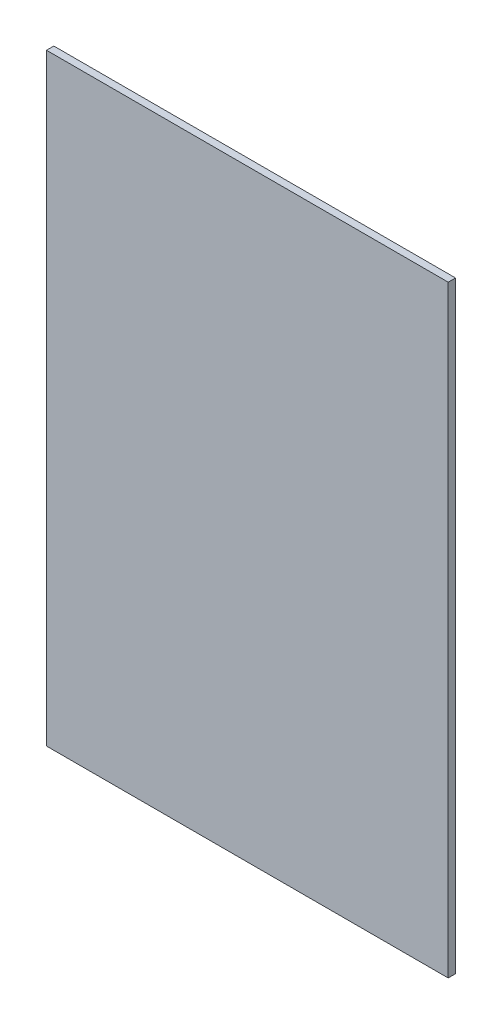
ISO-10303-21;
HEADER;
FILE_DESCRIPTION(('STEP AP214'),'2;1');
FILE_NAME('part.step','',(''),(''),'','','');
FILE_SCHEMA(('AUTOMOTIVE_DESIGN { 1 0 10303 214 1 1 1 1 }'));
ENDSEC;
DATA;
#1=APPLICATION_CONTEXT('core data for automotive mechanical design processes');
#2=APPLICATION_PROTOCOL_DEFINITION('international standard','automotive_design',2000,#1);
#3=PRODUCT_CONTEXT('',#1,'mechanical');
#4=PRODUCT('Part','Part','',(#3));
#5=PRODUCT_RELATED_PRODUCT_CATEGORY('part','',(#4));
#6=PRODUCT_DEFINITION_FORMATION('','',#4);
#7=PRODUCT_DEFINITION_CONTEXT('part definition',#1,'design');
#8=PRODUCT_DEFINITION('design','',#6,#7);
#9=PRODUCT_DEFINITION_SHAPE('','',#8);
#10=(LENGTH_UNIT() NAMED_UNIT(*) SI_UNIT(.MILLI.,.METRE.));
#11=(NAMED_UNIT(*) PLANE_ANGLE_UNIT() SI_UNIT($,.RADIAN.));
#12=(NAMED_UNIT(*) SI_UNIT($,.STERADIAN.) SOLID_ANGLE_UNIT());
#13=UNCERTAINTY_MEASURE_WITH_UNIT(LENGTH_MEASURE(1.E-05),#10,'distance_accuracy_value','');
#14=(GEOMETRIC_REPRESENTATION_CONTEXT(3) GLOBAL_UNCERTAINTY_ASSIGNED_CONTEXT((#13)) GLOBAL_UNIT_ASSIGNED_CONTEXT((#10,
#11,#12)) REPRESENTATION_CONTEXT('',''));
#15=CARTESIAN_POINT('',(0.,0.,0.));
#16=DIRECTION('',(0.,0.,1.));
#17=DIRECTION('',(1.,0.,0.));
#18=AXIS2_PLACEMENT_3D('',#15,#16,#17);
#19=CARTESIAN_POINT('',(0.,0.,11.1125));
#20=DIRECTION('',(1.,0.,0.));
#21=DIRECTION('',(0.,0.,-1.));
#22=AXIS2_PLACEMENT_3D('',#19,#20,#21);
#23=PLANE('',#22);
#24=DIRECTION('',(0.,-1.,0.));
#25=VECTOR('',#24,1.);
#26=CARTESIAN_POINT('',(0.,0.,0.));
#27=LINE('',#26,#25);
#28=CARTESIAN_POINT('',(0.,914.4,0.));
#29=VERTEX_POINT('',#28);
#30=CARTESIAN_POINT('',(0.,0.,0.));
#31=VERTEX_POINT('',#30);
#32=EDGE_CURVE('E95',#29,#31,#27,.T.);
#33=ORIENTED_EDGE('',*,*,#32,.T.);
#34=DIRECTION('',(0.,0.,-1.));
#35=VECTOR('',#34,1.);
#36=CARTESIAN_POINT('',(0.,0.,11.1125));
#37=LINE('',#36,#35);
#38=CARTESIAN_POINT('',(0.,0.,11.1125));
#39=VERTEX_POINT('',#38);
#40=EDGE_CURVE('E11',#39,#31,#37,.T.);
#41=ORIENTED_EDGE('',*,*,#40,.F.);
#42=DIRECTION('',(0.,-1.,0.));
#43=VECTOR('',#42,1.);
#44=CARTESIAN_POINT('',(0.,0.,11.1125));
#45=LINE('',#44,#43);
#46=CARTESIAN_POINT('',(0.,914.4,11.1125));
#47=VERTEX_POINT('',#46);
#48=EDGE_CURVE('E83',#47,#39,#45,.T.);
#49=ORIENTED_EDGE('',*,*,#48,.F.);
#50=DIRECTION('',(0.,0.,-1.));
#51=VECTOR('',#50,1.);
#52=CARTESIAN_POINT('',(0.,914.4,11.1125));
#53=LINE('',#52,#51);
#54=EDGE_CURVE('E91',#47,#29,#53,.T.);
#55=ORIENTED_EDGE('',*,*,#54,.T.);
#56=EDGE_LOOP('',(#33,#41,#49,#55));
#57=FACE_BOUND('',#56,.T.);
#58=ADVANCED_FACE('F32',(#57),#23,.F.);
#59=CARTESIAN_POINT('',(0.,0.,11.1125));
#60=DIRECTION('',(0.,1.,0.));
#61=DIRECTION('',(0.,0.,1.));
#62=AXIS2_PLACEMENT_3D('',#59,#60,#61);
#63=PLANE('',#62);
#64=DIRECTION('',(1.,0.,0.));
#65=VECTOR('',#64,1.);
#66=CARTESIAN_POINT('',(0.,0.,0.));
#67=LINE('',#66,#65);
#68=CARTESIAN_POINT('',(609.6,0.,0.));
#69=VERTEX_POINT('',#68);
#70=EDGE_CURVE('E87',#31,#69,#67,.T.);
#71=ORIENTED_EDGE('',*,*,#70,.T.);
#72=DIRECTION('',(0.,0.,-1.));
#73=VECTOR('',#72,1.);
#74=CARTESIAN_POINT('',(609.6,0.,11.1125));
#75=LINE('',#74,#73);
#76=CARTESIAN_POINT('',(609.6,0.,11.1125));
#77=VERTEX_POINT('',#76);
#78=EDGE_CURVE('E40',#77,#69,#75,.T.);
#79=ORIENTED_EDGE('',*,*,#78,.F.);
#80=DIRECTION('',(1.,0.,0.));
#81=VECTOR('',#80,1.);
#82=CARTESIAN_POINT('',(0.,0.,11.1125));
#83=LINE('',#82,#81);
#84=EDGE_CURVE('E78',#39,#77,#83,.T.);
#85=ORIENTED_EDGE('',*,*,#84,.F.);
#86=ORIENTED_EDGE('',*,*,#40,.T.);
#87=EDGE_LOOP('',(#71,#79,#85,#86));
#88=FACE_BOUND('',#87,.T.);
#89=ADVANCED_FACE('F86',(#88),#63,.F.);
#90=CARTESIAN_POINT('',(609.6,0.,11.1125));
#91=DIRECTION('',(-1.,0.,0.));
#92=DIRECTION('',(0.,-1.,0.));
#93=AXIS2_PLACEMENT_3D('',#90,#91,#92);
#94=PLANE('',#93);
#95=DIRECTION('',(0.,1.,0.));
#96=VECTOR('',#95,1.);
#97=CARTESIAN_POINT('',(609.6,0.,0.));
#98=LINE('',#97,#96);
#99=CARTESIAN_POINT('',(609.6,914.4,0.));
#100=VERTEX_POINT('',#99);
#101=EDGE_CURVE('E65',#69,#100,#98,.T.);
#102=ORIENTED_EDGE('',*,*,#101,.T.);
#103=DIRECTION('',(0.,0.,-1.));
#104=VECTOR('',#103,1.);
#105=CARTESIAN_POINT('',(609.6,914.4,11.1125));
#106=LINE('',#105,#104);
#107=CARTESIAN_POINT('',(609.6,914.4,11.1125));
#108=VERTEX_POINT('',#107);
#109=EDGE_CURVE('E88',#108,#100,#106,.T.);
#110=ORIENTED_EDGE('',*,*,#109,.F.);
#111=DIRECTION('',(0.,1.,0.));
#112=VECTOR('',#111,1.);
#113=CARTESIAN_POINT('',(609.6,0.,11.1125));
#114=LINE('',#113,#112);
#115=EDGE_CURVE('E81',#77,#108,#114,.T.);
#116=ORIENTED_EDGE('',*,*,#115,.F.);
#117=ORIENTED_EDGE('',*,*,#78,.T.);
#118=EDGE_LOOP('',(#102,#110,#116,#117));
#119=FACE_BOUND('',#118,.T.);
#120=ADVANCED_FACE('F89',(#119),#94,.F.);
#121=CARTESIAN_POINT('',(0.,914.4,11.1125));
#122=DIRECTION('',(0.,-1.,0.));
#123=DIRECTION('',(0.,0.,-1.));
#124=AXIS2_PLACEMENT_3D('',#121,#122,#123);
#125=PLANE('',#124);
#126=DIRECTION('',(-1.,0.,0.));
#127=VECTOR('',#126,1.);
#128=CARTESIAN_POINT('',(0.,914.4,0.));
#129=LINE('',#128,#127);
#130=EDGE_CURVE('E71',#100,#29,#129,.T.);
#131=ORIENTED_EDGE('',*,*,#130,.T.);
#132=ORIENTED_EDGE('',*,*,#54,.F.);
#133=DIRECTION('',(-1.,0.,0.));
#134=VECTOR('',#133,1.);
#135=CARTESIAN_POINT('',(0.,914.4,11.1125));
#136=LINE('',#135,#134);
#137=EDGE_CURVE('E48',#108,#47,#136,.T.);
#138=ORIENTED_EDGE('',*,*,#137,.F.);
#139=ORIENTED_EDGE('',*,*,#109,.T.);
#140=EDGE_LOOP('',(#131,#132,#138,#139));
#141=FACE_BOUND('',#140,.T.);
#142=ADVANCED_FACE('F102',(#141),#125,.F.);
#143=CARTESIAN_POINT('',(0.,0.,11.1125));
#144=DIRECTION('',(0.,0.,-1.));
#145=DIRECTION('',(-1.,0.,0.));
#146=AXIS2_PLACEMENT_3D('',#143,#144,#145);
#147=PLANE('',#146);
#148=ORIENTED_EDGE('',*,*,#48,.T.);
#149=ORIENTED_EDGE('',*,*,#84,.T.);
#150=ORIENTED_EDGE('',*,*,#115,.T.);
#151=ORIENTED_EDGE('',*,*,#137,.T.);
#152=EDGE_LOOP('',(#148,#149,#150,#151));
#153=FACE_BOUND('',#152,.T.);
#154=ADVANCED_FACE('F79',(#153),#147,.F.);
#155=CARTESIAN_POINT('',(0.,0.,0.));
#156=DIRECTION('',(0.,0.,-1.));
#157=DIRECTION('',(-1.,0.,0.));
#158=AXIS2_PLACEMENT_3D('',#155,#156,#157);
#159=PLANE('',#158);
#160=ORIENTED_EDGE('',*,*,#32,.F.);
#161=ORIENTED_EDGE('',*,*,#130,.F.);
#162=ORIENTED_EDGE('',*,*,#101,.F.);
#163=ORIENTED_EDGE('',*,*,#70,.F.);
#164=EDGE_LOOP('',(#160,#161,#162,#163));
#165=FACE_BOUND('',#164,.T.);
#166=ADVANCED_FACE('F105',(#165),#159,.T.);
#167=CLOSED_SHELL('',(#58,#89,#120,#142,#154,#166));
#168=MANIFOLD_SOLID_BREP('B2',#167);
#169=ADVANCED_BREP_SHAPE_REPRESENTATION('',(#18,#168),#14);
#170=SHAPE_DEFINITION_REPRESENTATION(#9,#169);
ENDSEC;
END-ISO-10303-21;
